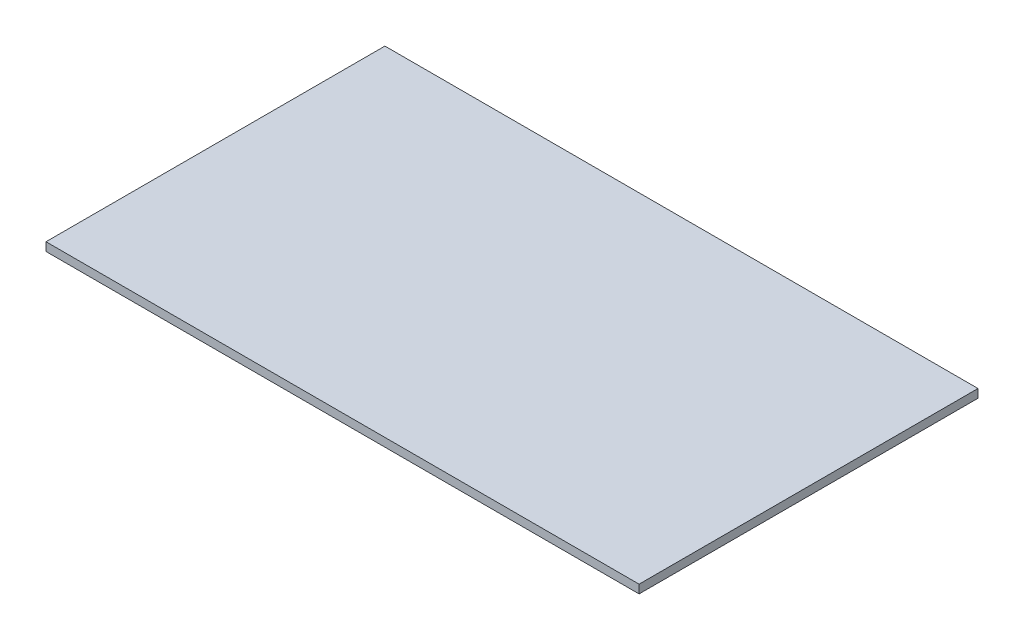
ISO-10303-21;
HEADER;
FILE_DESCRIPTION(('STEP AP214'),'2;1');
FILE_NAME('part.step','',(''),(''),'','','');
FILE_SCHEMA(('AUTOMOTIVE_DESIGN { 1 0 10303 214 1 1 1 1 }'));
ENDSEC;
DATA;
#1=APPLICATION_CONTEXT('core data for automotive mechanical design processes');
#2=APPLICATION_PROTOCOL_DEFINITION('international standard','automotive_design',2000,#1);
#3=PRODUCT_CONTEXT('',#1,'mechanical');
#4=PRODUCT('Part','Part','',(#3));
#5=PRODUCT_RELATED_PRODUCT_CATEGORY('part','',(#4));
#6=PRODUCT_DEFINITION_FORMATION('','',#4);
#7=PRODUCT_DEFINITION_CONTEXT('part definition',#1,'design');
#8=PRODUCT_DEFINITION('design','',#6,#7);
#9=PRODUCT_DEFINITION_SHAPE('','',#8);
#10=(LENGTH_UNIT() NAMED_UNIT(*) SI_UNIT(.MILLI.,.METRE.));
#11=(NAMED_UNIT(*) PLANE_ANGLE_UNIT() SI_UNIT($,.RADIAN.));
#12=(NAMED_UNIT(*) SI_UNIT($,.STERADIAN.) SOLID_ANGLE_UNIT());
#13=UNCERTAINTY_MEASURE_WITH_UNIT(LENGTH_MEASURE(1.E-05),#10,'distance_accuracy_value','');
#14=(GEOMETRIC_REPRESENTATION_CONTEXT(3) GLOBAL_UNCERTAINTY_ASSIGNED_CONTEXT((#13)) GLOBAL_UNIT_ASSIGNED_CONTEXT((#10,
#11,#12)) REPRESENTATION_CONTEXT('',''));
#15=CARTESIAN_POINT('',(0.,0.,0.));
#16=DIRECTION('',(0.,0.,1.));
#17=DIRECTION('',(1.,0.,0.));
#18=AXIS2_PLACEMENT_3D('',#15,#16,#17);
#19=CARTESIAN_POINT('',(175.,5.,-100.));
#20=DIRECTION('',(-1.,0.,0.));
#21=DIRECTION('',(0.,0.,1.));
#22=AXIS2_PLACEMENT_3D('',#19,#20,#21);
#23=PLANE('',#22);
#24=DIRECTION('',(0.,0.,-1.));
#25=VECTOR('',#24,1.);
#26=CARTESIAN_POINT('',(175.,0.,-100.));
#27=LINE('',#26,#25);
#28=CARTESIAN_POINT('',(175.,0.,100.));
#29=VERTEX_POINT('',#28);
#30=CARTESIAN_POINT('',(175.,0.,-100.));
#31=VERTEX_POINT('',#30);
#32=EDGE_CURVE('E96',#29,#31,#27,.T.);
#33=ORIENTED_EDGE('',*,*,#32,.T.);
#34=DIRECTION('',(0.,-1.,0.));
#35=VECTOR('',#34,1.);
#36=CARTESIAN_POINT('',(175.,5.,-100.));
#37=LINE('',#36,#35);
#38=CARTESIAN_POINT('',(175.,5.,-100.));
#39=VERTEX_POINT('',#38);
#40=EDGE_CURVE('E11',#39,#31,#37,.T.);
#41=ORIENTED_EDGE('',*,*,#40,.F.);
#42=DIRECTION('',(0.,0.,-1.));
#43=VECTOR('',#42,1.);
#44=CARTESIAN_POINT('',(175.,5.,-100.));
#45=LINE('',#44,#43);
#46=CARTESIAN_POINT('',(175.,5.,100.));
#47=VERTEX_POINT('',#46);
#48=EDGE_CURVE('E84',#47,#39,#45,.T.);
#49=ORIENTED_EDGE('',*,*,#48,.F.);
#50=DIRECTION('',(0.,-1.,0.));
#51=VECTOR('',#50,1.);
#52=CARTESIAN_POINT('',(175.,5.,100.));
#53=LINE('',#52,#51);
#54=EDGE_CURVE('E92',#47,#29,#53,.T.);
#55=ORIENTED_EDGE('',*,*,#54,.T.);
#56=EDGE_LOOP('',(#33,#41,#49,#55));
#57=FACE_BOUND('',#56,.T.);
#58=ADVANCED_FACE('F33',(#57),#23,.F.);
#59=CARTESIAN_POINT('',(-175.,5.,-100.));
#60=DIRECTION('',(0.,0.,1.));
#61=DIRECTION('',(1.,0.,0.));
#62=AXIS2_PLACEMENT_3D('',#59,#60,#61);
#63=PLANE('',#62);
#64=DIRECTION('',(-1.,0.,0.));
#65=VECTOR('',#64,1.);
#66=CARTESIAN_POINT('',(-175.,0.,-100.));
#67=LINE('',#66,#65);
#68=CARTESIAN_POINT('',(-175.,0.,-100.));
#69=VERTEX_POINT('',#68);
#70=EDGE_CURVE('E88',#31,#69,#67,.T.);
#71=ORIENTED_EDGE('',*,*,#70,.T.);
#72=DIRECTION('',(0.,-1.,0.));
#73=VECTOR('',#72,1.);
#74=CARTESIAN_POINT('',(-175.,5.,-100.));
#75=LINE('',#74,#73);
#76=CARTESIAN_POINT('',(-175.,5.,-100.));
#77=VERTEX_POINT('',#76);
#78=EDGE_CURVE('E41',#77,#69,#75,.T.);
#79=ORIENTED_EDGE('',*,*,#78,.F.);
#80=DIRECTION('',(-1.,0.,0.));
#81=VECTOR('',#80,1.);
#82=CARTESIAN_POINT('',(-175.,5.,-100.));
#83=LINE('',#82,#81);
#84=EDGE_CURVE('E79',#39,#77,#83,.T.);
#85=ORIENTED_EDGE('',*,*,#84,.F.);
#86=ORIENTED_EDGE('',*,*,#40,.T.);
#87=EDGE_LOOP('',(#71,#79,#85,#86));
#88=FACE_BOUND('',#87,.T.);
#89=ADVANCED_FACE('F87',(#88),#63,.F.);
#90=CARTESIAN_POINT('',(-175.,5.,-100.));
#91=DIRECTION('',(1.,0.,0.));
#92=DIRECTION('',(0.,0.,-1.));
#93=AXIS2_PLACEMENT_3D('',#90,#91,#92);
#94=PLANE('',#93);
#95=DIRECTION('',(0.,0.,1.));
#96=VECTOR('',#95,1.);
#97=CARTESIAN_POINT('',(-175.,0.,-100.));
#98=LINE('',#97,#96);
#99=CARTESIAN_POINT('',(-175.,0.,100.));
#100=VERTEX_POINT('',#99);
#101=EDGE_CURVE('E66',#69,#100,#98,.T.);
#102=ORIENTED_EDGE('',*,*,#101,.T.);
#103=DIRECTION('',(0.,-1.,0.));
#104=VECTOR('',#103,1.);
#105=CARTESIAN_POINT('',(-175.,5.,100.));
#106=LINE('',#105,#104);
#107=CARTESIAN_POINT('',(-175.,5.,100.));
#108=VERTEX_POINT('',#107);
#109=EDGE_CURVE('E89',#108,#100,#106,.T.);
#110=ORIENTED_EDGE('',*,*,#109,.F.);
#111=DIRECTION('',(0.,0.,1.));
#112=VECTOR('',#111,1.);
#113=CARTESIAN_POINT('',(-175.,5.,-100.));
#114=LINE('',#113,#112);
#115=EDGE_CURVE('E82',#77,#108,#114,.T.);
#116=ORIENTED_EDGE('',*,*,#115,.F.);
#117=ORIENTED_EDGE('',*,*,#78,.T.);
#118=EDGE_LOOP('',(#102,#110,#116,#117));
#119=FACE_BOUND('',#118,.T.);
#120=ADVANCED_FACE('F90',(#119),#94,.F.);
#121=CARTESIAN_POINT('',(-175.,5.,100.));
#122=DIRECTION('',(0.,0.,-1.));
#123=DIRECTION('',(-1.,0.,0.));
#124=AXIS2_PLACEMENT_3D('',#121,#122,#123);
#125=PLANE('',#124);
#126=DIRECTION('',(1.,0.,0.));
#127=VECTOR('',#126,1.);
#128=CARTESIAN_POINT('',(-175.,0.,100.));
#129=LINE('',#128,#127);
#130=EDGE_CURVE('E72',#100,#29,#129,.T.);
#131=ORIENTED_EDGE('',*,*,#130,.T.);
#132=ORIENTED_EDGE('',*,*,#54,.F.);
#133=DIRECTION('',(1.,0.,0.));
#134=VECTOR('',#133,1.);
#135=CARTESIAN_POINT('',(-175.,5.,100.));
#136=LINE('',#135,#134);
#137=EDGE_CURVE('E49',#108,#47,#136,.T.);
#138=ORIENTED_EDGE('',*,*,#137,.F.);
#139=ORIENTED_EDGE('',*,*,#109,.T.);
#140=EDGE_LOOP('',(#131,#132,#138,#139));
#141=FACE_BOUND('',#140,.T.);
#142=ADVANCED_FACE('F103',(#141),#125,.F.);
#143=CARTESIAN_POINT('',(0.,5.,0.));
#144=DIRECTION('',(0.,1.,0.));
#145=DIRECTION('',(0.,0.,1.));
#146=AXIS2_PLACEMENT_3D('',#143,#144,#145);
#147=PLANE('',#146);
#148=ORIENTED_EDGE('',*,*,#48,.T.);
#149=ORIENTED_EDGE('',*,*,#84,.T.);
#150=ORIENTED_EDGE('',*,*,#115,.T.);
#151=ORIENTED_EDGE('',*,*,#137,.T.);
#152=EDGE_LOOP('',(#148,#149,#150,#151));
#153=FACE_BOUND('',#152,.T.);
#154=ADVANCED_FACE('F80',(#153),#147,.T.);
#155=CARTESIAN_POINT('',(0.,0.,0.));
#156=DIRECTION('',(0.,1.,0.));
#157=DIRECTION('',(0.,0.,1.));
#158=AXIS2_PLACEMENT_3D('',#155,#156,#157);
#159=PLANE('',#158);
#160=ORIENTED_EDGE('',*,*,#32,.F.);
#161=ORIENTED_EDGE('',*,*,#130,.F.);
#162=ORIENTED_EDGE('',*,*,#101,.F.);
#163=ORIENTED_EDGE('',*,*,#70,.F.);
#164=EDGE_LOOP('',(#160,#161,#162,#163));
#165=FACE_BOUND('',#164,.T.);
#166=ADVANCED_FACE('F106',(#165),#159,.F.);
#167=CLOSED_SHELL('',(#58,#89,#120,#142,#154,#166));
#168=MANIFOLD_SOLID_BREP('B2',#167);
#169=ADVANCED_BREP_SHAPE_REPRESENTATION('',(#18,#168),#14);
#170=SHAPE_DEFINITION_REPRESENTATION(#9,#169);
ENDSEC;
END-ISO-10303-21;
